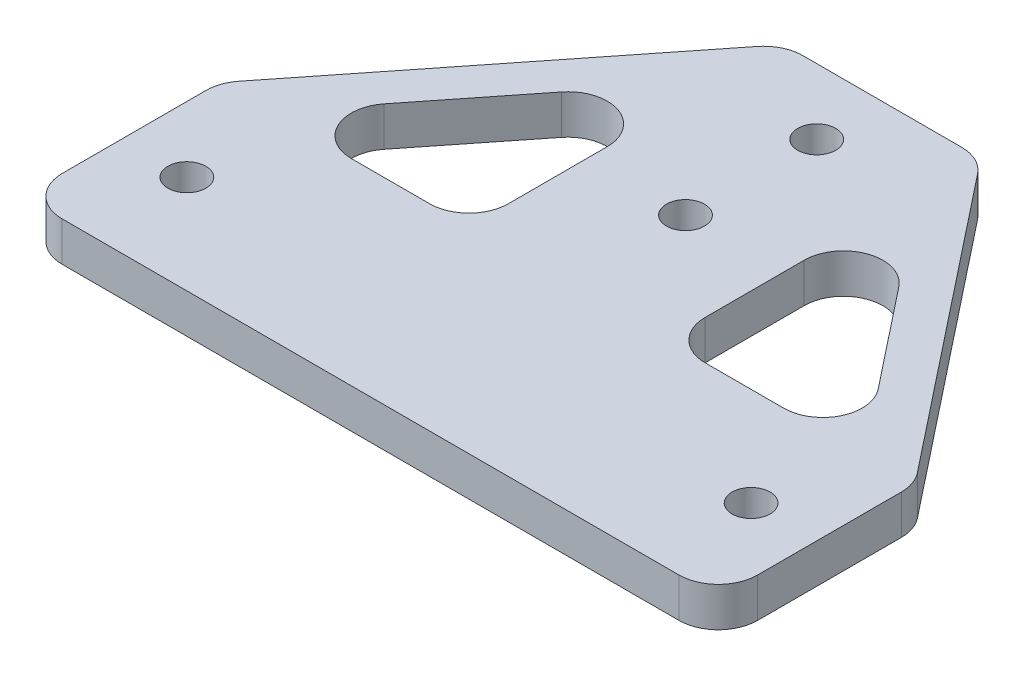
ISO-10303-21;
HEADER;
FILE_DESCRIPTION(('STEP AP214'),'2;1');
FILE_NAME('part.step','',(''),(''),'','','');
FILE_SCHEMA(('AUTOMOTIVE_DESIGN { 1 0 10303 214 1 1 1 1 }'));
ENDSEC;
DATA;
#1=APPLICATION_CONTEXT('core data for automotive mechanical design processes');
#2=APPLICATION_PROTOCOL_DEFINITION('international standard','automotive_design',2000,#1);
#3=PRODUCT_CONTEXT('',#1,'mechanical');
#4=PRODUCT('Part','Part','',(#3));
#5=PRODUCT_RELATED_PRODUCT_CATEGORY('part','',(#4));
#6=PRODUCT_DEFINITION_FORMATION('','',#4);
#7=PRODUCT_DEFINITION_CONTEXT('part definition',#1,'design');
#8=PRODUCT_DEFINITION('design','',#6,#7);
#9=PRODUCT_DEFINITION_SHAPE('','',#8);
#10=(LENGTH_UNIT() NAMED_UNIT(*) SI_UNIT(.MILLI.,.METRE.));
#11=(NAMED_UNIT(*) PLANE_ANGLE_UNIT() SI_UNIT($,.RADIAN.));
#12=(NAMED_UNIT(*) SI_UNIT($,.STERADIAN.) SOLID_ANGLE_UNIT());
#13=UNCERTAINTY_MEASURE_WITH_UNIT(LENGTH_MEASURE(1.E-05),#10,'distance_accuracy_value','');
#14=(GEOMETRIC_REPRESENTATION_CONTEXT(3) GLOBAL_UNCERTAINTY_ASSIGNED_CONTEXT((#13)) GLOBAL_UNIT_ASSIGNED_CONTEXT((#10,
#11,#12)) REPRESENTATION_CONTEXT('',''));
#15=CARTESIAN_POINT('',(0.,0.,0.));
#16=DIRECTION('',(0.,0.,1.));
#17=DIRECTION('',(1.,0.,0.));
#18=AXIS2_PLACEMENT_3D('',#15,#16,#17);
#19=CARTESIAN_POINT('',(0.,3.,-7.5));
#20=DIRECTION('',(0.,0.,1.));
#21=DIRECTION('',(1.,0.,0.));
#22=AXIS2_PLACEMENT_3D('',#19,#20,#21);
#23=PLANE('',#22);
#24=DIRECTION('',(-1.,0.,0.));
#25=VECTOR('',#24,1.);
#26=CARTESIAN_POINT('',(0.,3.,-7.5));
#27=LINE('',#26,#25);
#28=CARTESIAN_POINT('',(16.472386067493,3.,-7.5));
#29=VERTEX_POINT('',#28);
#30=CARTESIAN_POINT('',(10.5,3.,-7.5));
#31=VERTEX_POINT('',#30);
#32=EDGE_CURVE('E226',#29,#31,#27,.T.);
#33=ORIENTED_EDGE('',*,*,#32,.F.);
#34=DIRECTION('',(0.,-1.,0.));
#35=VECTOR('',#34,1.);
#36=CARTESIAN_POINT('',(16.472386067493,0.,-7.5));
#37=LINE('',#36,#35);
#38=CARTESIAN_POINT('',(16.472386067493,0.,-7.5));
#39=VERTEX_POINT('',#38);
#40=EDGE_CURVE('E211',#29,#39,#37,.T.);
#41=ORIENTED_EDGE('',*,*,#40,.T.);
#42=DIRECTION('',(-1.,0.,0.));
#43=VECTOR('',#42,1.);
#44=CARTESIAN_POINT('',(0.,0.,-7.5));
#45=LINE('',#44,#43);
#46=CARTESIAN_POINT('',(10.5,0.,-7.5));
#47=VERTEX_POINT('',#46);
#48=EDGE_CURVE('E223',#39,#47,#45,.T.);
#49=ORIENTED_EDGE('',*,*,#48,.T.);
#50=DIRECTION('',(0.,-1.,0.));
#51=VECTOR('',#50,1.);
#52=CARTESIAN_POINT('',(10.5,3.,-7.5));
#53=LINE('',#52,#51);
#54=EDGE_CURVE('E228',#47,#31,#53,.F.);
#55=ORIENTED_EDGE('',*,*,#54,.T.);
#56=EDGE_LOOP('',(#33,#41,#49,#55));
#57=FACE_BOUND('',#56,.T.);
#58=ADVANCED_FACE('F45',(#57),#23,.F.);
#59=CARTESIAN_POINT('',(7.50000000000001,3.,0.));
#60=DIRECTION('',(-1.,0.,0.));
#61=DIRECTION('',(0.,0.,1.));
#62=AXIS2_PLACEMENT_3D('',#59,#60,#61);
#63=PLANE('',#62);
#64=DIRECTION('',(0.,0.,-1.));
#65=VECTOR('',#64,1.);
#66=CARTESIAN_POINT('',(7.50000000000001,0.,0.));
#67=LINE('',#66,#65);
#68=CARTESIAN_POINT('',(7.5,0.,-10.5));
#69=VERTEX_POINT('',#68);
#70=CARTESIAN_POINT('',(7.5,0.,-18.0440666115701));
#71=VERTEX_POINT('',#70);
#72=EDGE_CURVE('E232',#69,#71,#67,.T.);
#73=ORIENTED_EDGE('',*,*,#72,.T.);
#74=DIRECTION('',(0.,-1.,0.));
#75=VECTOR('',#74,1.);
#76=CARTESIAN_POINT('',(7.5,3.,-18.0440666115701));
#77=LINE('',#76,#75);
#78=CARTESIAN_POINT('',(7.5,3.,-18.0440666115701));
#79=VERTEX_POINT('',#78);
#80=EDGE_CURVE('E253',#71,#79,#77,.F.);
#81=ORIENTED_EDGE('',*,*,#80,.T.);
#82=DIRECTION('',(0.,0.,-1.));
#83=VECTOR('',#82,1.);
#84=CARTESIAN_POINT('',(7.50000000000001,3.,0.));
#85=LINE('',#84,#83);
#86=CARTESIAN_POINT('',(7.5,3.,-10.5));
#87=VERTEX_POINT('',#86);
#88=EDGE_CURVE('E412',#87,#79,#85,.T.);
#89=ORIENTED_EDGE('',*,*,#88,.F.);
#90=DIRECTION('',(0.,-1.,0.));
#91=VECTOR('',#90,1.);
#92=CARTESIAN_POINT('',(7.5,0.,-10.5));
#93=LINE('',#92,#91);
#94=EDGE_CURVE('E250',#87,#69,#93,.T.);
#95=ORIENTED_EDGE('',*,*,#94,.T.);
#96=EDGE_LOOP('',(#73,#81,#89,#95));
#97=FACE_BOUND('',#96,.T.);
#98=ADVANCED_FACE('F450',(#97),#63,.F.);
#99=CARTESIAN_POINT('',(19.940234791889,3.,-15.7860192102455));
#100=DIRECTION('',(0.784045824461761,0.,-0.620702944365561));
#101=DIRECTION('',(-0.620702944365561,0.,-0.784045824461762));
#102=AXIS2_PLACEMENT_3D('',#99,#100,#101);
#103=PLANE('',#102);
#104=DIRECTION('',(0.620702944365561,0.,0.784045824461762));
#105=VECTOR('',#104,1.);
#106=CARTESIAN_POINT('',(19.940234791889,0.,-15.7860192102455));
#107=LINE('',#106,#105);
#108=CARTESIAN_POINT('',(8.4008305071318,0.,-30.3621088330967));
#109=VERTEX_POINT('',#108);
#110=CARTESIAN_POINT('',(25.8521374733853,0.,-8.31835266519754));
#111=VERTEX_POINT('',#110);
#112=EDGE_CURVE('E378',#109,#111,#107,.T.);
#113=ORIENTED_EDGE('',*,*,#112,.F.);
#114=DIRECTION('',(0.,-1.,0.));
#115=VECTOR('',#114,1.);
#116=CARTESIAN_POINT('',(8.4008305071318,3.,-30.3621088330967));
#117=LINE('',#116,#115);
#118=CARTESIAN_POINT('',(8.4008305071318,3.,-30.3621088330967));
#119=VERTEX_POINT('',#118);
#120=EDGE_CURVE('E305',#109,#119,#117,.F.);
#121=ORIENTED_EDGE('',*,*,#120,.T.);
#122=DIRECTION('',(0.620702944365561,0.,0.784045824461762));
#123=VECTOR('',#122,1.);
#124=CARTESIAN_POINT('',(19.940234791889,3.,-15.7860192102455));
#125=LINE('',#124,#123);
#126=CARTESIAN_POINT('',(25.8521374733853,3.,-8.31835266519754));
#127=VERTEX_POINT('',#126);
#128=EDGE_CURVE('E734',#119,#127,#125,.T.);
#129=ORIENTED_EDGE('',*,*,#128,.T.);
#130=DIRECTION('',(0.,-1.,0.));
#131=VECTOR('',#130,1.);
#132=CARTESIAN_POINT('',(25.8521374733853,0.,-8.31835266519754));
#133=LINE('',#132,#131);
#134=EDGE_CURVE('E302',#127,#111,#133,.T.);
#135=ORIENTED_EDGE('',*,*,#134,.T.);
#136=EDGE_LOOP('',(#113,#121,#129,#135));
#137=FACE_BOUND('',#136,.T.);
#138=ADVANCED_FACE('F456',(#137),#103,.T.);
#139=CARTESIAN_POINT('',(0.,3.,-31.5));
#140=DIRECTION('',(0.,0.,-1.));
#141=DIRECTION('',(-1.,0.,0.));
#142=AXIS2_PLACEMENT_3D('',#139,#140,#141);
#143=PLANE('',#142);
#144=DIRECTION('',(1.,0.,0.));
#145=VECTOR('',#144,1.);
#146=CARTESIAN_POINT('',(0.,0.,-31.5));
#147=LINE('',#146,#145);
#148=CARTESIAN_POINT('',(-6.04869303374651,0.,-31.5));
#149=VERTEX_POINT('',#148);
#150=CARTESIAN_POINT('',(6.04869303374652,0.,-31.5));
#151=VERTEX_POINT('',#150);
#152=EDGE_CURVE('E381',#149,#151,#147,.T.);
#153=ORIENTED_EDGE('',*,*,#152,.F.);
#154=DIRECTION('',(0.,-1.,0.));
#155=VECTOR('',#154,1.);
#156=CARTESIAN_POINT('',(-6.04869303374651,3.,-31.5));
#157=LINE('',#156,#155);
#158=CARTESIAN_POINT('',(-6.04869303374651,3.,-31.5));
#159=VERTEX_POINT('',#158);
#160=EDGE_CURVE('E300',#149,#159,#157,.F.);
#161=ORIENTED_EDGE('',*,*,#160,.T.);
#162=DIRECTION('',(1.,0.,0.));
#163=VECTOR('',#162,1.);
#164=CARTESIAN_POINT('',(0.,3.,-31.5));
#165=LINE('',#164,#163);
#166=CARTESIAN_POINT('',(6.04869303374652,3.,-31.5));
#167=VERTEX_POINT('',#166);
#168=EDGE_CURVE('E737',#159,#167,#165,.T.);
#169=ORIENTED_EDGE('',*,*,#168,.T.);
#170=DIRECTION('',(0.,-1.,0.));
#171=VECTOR('',#170,1.);
#172=CARTESIAN_POINT('',(6.04869303374652,3.,-31.5));
#173=LINE('',#172,#171);
#174=EDGE_CURVE('E297',#167,#151,#173,.T.);
#175=ORIENTED_EDGE('',*,*,#174,.T.);
#176=EDGE_LOOP('',(#153,#161,#169,#175));
#177=FACE_BOUND('',#176,.T.);
#178=ADVANCED_FACE('F471',(#177),#143,.T.);
#179=CARTESIAN_POINT('',(-19.940234791889,3.,-15.7860192102455));
#180=DIRECTION('',(-0.784045824461761,0.,-0.620702944365561));
#181=DIRECTION('',(-0.620702944365561,0.,0.784045824461762));
#182=AXIS2_PLACEMENT_3D('',#179,#180,#181);
#183=PLANE('',#182);
#184=DIRECTION('',(0.620702944365561,0.,-0.784045824461762));
#185=VECTOR('',#184,1.);
#186=CARTESIAN_POINT('',(-19.940234791889,0.,-15.7860192102455));
#187=LINE('',#186,#185);
#188=CARTESIAN_POINT('',(-25.8521374733853,0.,-8.31835266519753));
#189=VERTEX_POINT('',#188);
#190=CARTESIAN_POINT('',(-8.40083050713179,0.,-30.3621088330967));
#191=VERTEX_POINT('',#190);
#192=EDGE_CURVE('E384',#189,#191,#187,.T.);
#193=ORIENTED_EDGE('',*,*,#192,.F.);
#194=DIRECTION('',(0.,-1.,0.));
#195=VECTOR('',#194,1.);
#196=CARTESIAN_POINT('',(-25.8521374733853,3.,-8.31835266519753));
#197=LINE('',#196,#195);
#198=CARTESIAN_POINT('',(-25.8521374733853,3.,-8.31835266519753));
#199=VERTEX_POINT('',#198);
#200=EDGE_CURVE('E295',#189,#199,#197,.F.);
#201=ORIENTED_EDGE('',*,*,#200,.T.);
#202=DIRECTION('',(0.620702944365561,0.,-0.784045824461762));
#203=VECTOR('',#202,1.);
#204=CARTESIAN_POINT('',(-19.940234791889,3.,-15.7860192102455));
#205=LINE('',#204,#203);
#206=CARTESIAN_POINT('',(-8.40083050713179,3.,-30.3621088330967));
#207=VERTEX_POINT('',#206);
#208=EDGE_CURVE('E740',#199,#207,#205,.T.);
#209=ORIENTED_EDGE('',*,*,#208,.T.);
#210=DIRECTION('',(0.,-1.,0.));
#211=VECTOR('',#210,1.);
#212=CARTESIAN_POINT('',(-8.40083050713179,3.,-30.3621088330967));
#213=LINE('',#212,#211);
#214=EDGE_CURVE('E292',#207,#191,#213,.T.);
#215=ORIENTED_EDGE('',*,*,#214,.T.);
#216=EDGE_LOOP('',(#193,#201,#209,#215));
#217=FACE_BOUND('',#216,.T.);
#218=ADVANCED_FACE('F468',(#217),#183,.T.);
#219=CARTESIAN_POINT('',(-26.5,3.,0.));
#220=DIRECTION('',(-1.,0.,0.));
#221=DIRECTION('',(0.,0.,1.));
#222=AXIS2_PLACEMENT_3D('',#219,#220,#221);
#223=PLANE('',#222);
#224=DIRECTION('',(0.,0.,-1.));
#225=VECTOR('',#224,1.);
#226=CARTESIAN_POINT('',(-26.5,0.,0.));
#227=LINE('',#226,#225);
#228=CARTESIAN_POINT('',(-26.5,0.,4.5));
#229=VERTEX_POINT('',#228);
#230=CARTESIAN_POINT('',(-26.5,0.,-6.45624383210085));
#231=VERTEX_POINT('',#230);
#232=EDGE_CURVE('E387',#229,#231,#227,.T.);
#233=ORIENTED_EDGE('',*,*,#232,.F.);
#234=DIRECTION('',(0.,-1.,0.));
#235=VECTOR('',#234,1.);
#236=CARTESIAN_POINT('',(-26.5,3.,4.5));
#237=LINE('',#236,#235);
#238=CARTESIAN_POINT('',(-26.5,3.,4.5));
#239=VERTEX_POINT('',#238);
#240=EDGE_CURVE('E67',#229,#239,#237,.F.);
#241=ORIENTED_EDGE('',*,*,#240,.T.);
#242=DIRECTION('',(0.,0.,-1.));
#243=VECTOR('',#242,1.);
#244=CARTESIAN_POINT('',(-26.5,3.,0.));
#245=LINE('',#244,#243);
#246=CARTESIAN_POINT('',(-26.5,3.,-6.45624383210085));
#247=VERTEX_POINT('',#246);
#248=EDGE_CURVE('E414',#239,#247,#245,.T.);
#249=ORIENTED_EDGE('',*,*,#248,.T.);
#250=DIRECTION('',(0.,-1.,0.));
#251=VECTOR('',#250,1.);
#252=CARTESIAN_POINT('',(-26.5,3.,-6.45624383210085));
#253=LINE('',#252,#251);
#254=EDGE_CURVE('E288',#247,#231,#253,.T.);
#255=ORIENTED_EDGE('',*,*,#254,.T.);
#256=EDGE_LOOP('',(#233,#241,#249,#255));
#257=FACE_BOUND('',#256,.T.);
#258=ADVANCED_FACE('F465',(#257),#223,.T.);
#259=CARTESIAN_POINT('',(0.,3.,7.5));
#260=DIRECTION('',(0.,0.,-1.));
#261=DIRECTION('',(-1.,0.,0.));
#262=AXIS2_PLACEMENT_3D('',#259,#260,#261);
#263=PLANE('',#262);
#264=DIRECTION('',(1.,0.,0.));
#265=VECTOR('',#264,1.);
#266=CARTESIAN_POINT('',(0.,0.,7.5));
#267=LINE('',#266,#265);
#268=CARTESIAN_POINT('',(-23.5,0.,7.5));
#269=VERTEX_POINT('',#268);
#270=CARTESIAN_POINT('',(23.5,0.,7.5));
#271=VERTEX_POINT('',#270);
#272=EDGE_CURVE('E239',#269,#271,#267,.T.);
#273=ORIENTED_EDGE('',*,*,#272,.T.);
#274=DIRECTION('',(0.,-1.,0.));
#275=VECTOR('',#274,1.);
#276=CARTESIAN_POINT('',(23.5,3.,7.5));
#277=LINE('',#276,#275);
#278=CARTESIAN_POINT('',(23.5,3.,7.5));
#279=VERTEX_POINT('',#278);
#280=EDGE_CURVE('E275',#271,#279,#277,.F.);
#281=ORIENTED_EDGE('',*,*,#280,.T.);
#282=DIRECTION('',(1.,0.,0.));
#283=VECTOR('',#282,1.);
#284=CARTESIAN_POINT('',(0.,3.,7.5));
#285=LINE('',#284,#283);
#286=CARTESIAN_POINT('',(-23.5,3.,7.5));
#287=VERTEX_POINT('',#286);
#288=EDGE_CURVE('E406',#287,#279,#285,.T.);
#289=ORIENTED_EDGE('',*,*,#288,.F.);
#290=DIRECTION('',(0.,-1.,0.));
#291=VECTOR('',#290,1.);
#292=CARTESIAN_POINT('',(-23.5,0.,7.5));
#293=LINE('',#292,#291);
#294=EDGE_CURVE('E272',#287,#269,#293,.T.);
#295=ORIENTED_EDGE('',*,*,#294,.T.);
#296=EDGE_LOOP('',(#273,#281,#289,#295));
#297=FACE_BOUND('',#296,.T.);
#298=ADVANCED_FACE('F393',(#297),#263,.F.);
#299=CARTESIAN_POINT('',(-7.5,3.,0.));
#300=DIRECTION('',(-1.,0.,0.));
#301=DIRECTION('',(0.,0.,1.));
#302=AXIS2_PLACEMENT_3D('',#299,#300,#301);
#303=PLANE('',#302);
#304=DIRECTION('',(0.,0.,-1.));
#305=VECTOR('',#304,1.);
#306=CARTESIAN_POINT('',(-7.5,3.,0.));
#307=LINE('',#306,#305);
#308=CARTESIAN_POINT('',(-7.5,3.,-10.5));
#309=VERTEX_POINT('',#308);
#310=CARTESIAN_POINT('',(-7.5,3.,-18.0440666115701));
#311=VERTEX_POINT('',#310);
#312=EDGE_CURVE('E346',#309,#311,#307,.T.);
#313=ORIENTED_EDGE('',*,*,#312,.T.);
#314=DIRECTION('',(0.,-1.,0.));
#315=VECTOR('',#314,1.);
#316=CARTESIAN_POINT('',(-7.5,0.,-18.0440666115701));
#317=LINE('',#316,#315);
#318=CARTESIAN_POINT('',(-7.5,0.,-18.0440666115701));
#319=VERTEX_POINT('',#318);
#320=EDGE_CURVE('E309',#311,#319,#317,.T.);
#321=ORIENTED_EDGE('',*,*,#320,.T.);
#322=DIRECTION('',(0.,0.,-1.));
#323=VECTOR('',#322,1.);
#324=CARTESIAN_POINT('',(-7.5,0.,0.));
#325=LINE('',#324,#323);
#326=CARTESIAN_POINT('',(-7.5,0.,-10.5));
#327=VERTEX_POINT('',#326);
#328=EDGE_CURVE('E362',#327,#319,#325,.T.);
#329=ORIENTED_EDGE('',*,*,#328,.F.);
#330=DIRECTION('',(0.,-1.,0.));
#331=VECTOR('',#330,1.);
#332=CARTESIAN_POINT('',(-7.5,3.,-10.5));
#333=LINE('',#332,#331);
#334=EDGE_CURVE('E307',#327,#309,#333,.F.);
#335=ORIENTED_EDGE('',*,*,#334,.T.);
#336=EDGE_LOOP('',(#313,#321,#329,#335));
#337=FACE_BOUND('',#336,.T.);
#338=ADVANCED_FACE('F365',(#337),#303,.T.);
#339=CARTESIAN_POINT('',(0.,3.,-7.5));
#340=DIRECTION('',(0.,0.,-1.));
#341=DIRECTION('',(-1.,0.,0.));
#342=AXIS2_PLACEMENT_3D('',#339,#340,#341);
#343=PLANE('',#342);
#344=DIRECTION('',(1.,0.,0.));
#345=VECTOR('',#344,1.);
#346=CARTESIAN_POINT('',(0.,0.,-7.5));
#347=LINE('',#346,#345);
#348=CARTESIAN_POINT('',(-16.472386067493,0.,-7.5));
#349=VERTEX_POINT('',#348);
#350=CARTESIAN_POINT('',(-10.5,0.,-7.5));
#351=VERTEX_POINT('',#350);
#352=EDGE_CURVE('E363',#349,#351,#347,.T.);
#353=ORIENTED_EDGE('',*,*,#352,.F.);
#354=DIRECTION('',(0.,-1.,0.));
#355=VECTOR('',#354,1.);
#356=CARTESIAN_POINT('',(-16.472386067493,3.,-7.5));
#357=LINE('',#356,#355);
#358=CARTESIAN_POINT('',(-16.472386067493,3.,-7.5));
#359=VERTEX_POINT('',#358);
#360=EDGE_CURVE('E218',#349,#359,#357,.F.);
#361=ORIENTED_EDGE('',*,*,#360,.T.);
#362=DIRECTION('',(1.,0.,0.));
#363=VECTOR('',#362,1.);
#364=CARTESIAN_POINT('',(0.,3.,-7.5));
#365=LINE('',#364,#363);
#366=CARTESIAN_POINT('',(-10.5,3.,-7.5));
#367=VERTEX_POINT('',#366);
#368=EDGE_CURVE('E343',#359,#367,#365,.T.);
#369=ORIENTED_EDGE('',*,*,#368,.T.);
#370=DIRECTION('',(0.,-1.,0.));
#371=VECTOR('',#370,1.);
#372=CARTESIAN_POINT('',(-10.5,0.,-7.5));
#373=LINE('',#372,#371);
#374=EDGE_CURVE('E317',#367,#351,#373,.T.);
#375=ORIENTED_EDGE('',*,*,#374,.T.);
#376=EDGE_LOOP('',(#353,#361,#369,#375));
#377=FACE_BOUND('',#376,.T.);
#378=ADVANCED_FACE('F352',(#377),#343,.T.);
#379=CARTESIAN_POINT('',(26.5,3.,0.));
#380=DIRECTION('',(-1.,0.,0.));
#381=DIRECTION('',(0.,0.,1.));
#382=AXIS2_PLACEMENT_3D('',#379,#380,#381);
#383=PLANE('',#382);
#384=DIRECTION('',(0.,0.,-1.));
#385=VECTOR('',#384,1.);
#386=CARTESIAN_POINT('',(26.5,3.,0.));
#387=LINE('',#386,#385);
#388=CARTESIAN_POINT('',(26.5,3.,4.5));
#389=VERTEX_POINT('',#388);
#390=CARTESIAN_POINT('',(26.5,3.,-6.45624383210086));
#391=VERTEX_POINT('',#390);
#392=EDGE_CURVE('E404',#389,#391,#387,.T.);
#393=ORIENTED_EDGE('',*,*,#392,.F.);
#394=DIRECTION('',(0.,-1.,0.));
#395=VECTOR('',#394,1.);
#396=CARTESIAN_POINT('',(26.5,3.,4.5));
#397=LINE('',#396,#395);
#398=CARTESIAN_POINT('',(26.5,0.,4.5));
#399=VERTEX_POINT('',#398);
#400=EDGE_CURVE('E257',#389,#399,#397,.T.);
#401=ORIENTED_EDGE('',*,*,#400,.T.);
#402=DIRECTION('',(0.,0.,-1.));
#403=VECTOR('',#402,1.);
#404=CARTESIAN_POINT('',(26.5,0.,0.));
#405=LINE('',#404,#403);
#406=CARTESIAN_POINT('',(26.5,0.,-6.45624383210086));
#407=VERTEX_POINT('',#406);
#408=EDGE_CURVE('E233',#399,#407,#405,.T.);
#409=ORIENTED_EDGE('',*,*,#408,.T.);
#410=DIRECTION('',(0.,-1.,0.));
#411=VECTOR('',#410,1.);
#412=CARTESIAN_POINT('',(26.5,3.,-6.45624383210086));
#413=LINE('',#412,#411);
#414=EDGE_CURVE('E255',#407,#391,#413,.F.);
#415=ORIENTED_EDGE('',*,*,#414,.T.);
#416=EDGE_LOOP('',(#393,#401,#409,#415));
#417=FACE_BOUND('',#416,.T.);
#418=ADVANCED_FACE('F408',(#417),#383,.F.);
#419=CARTESIAN_POINT('',(-17.5880973185037,3.,-13.9239103771488));
#420=DIRECTION('',(0.784045824461762,0.,0.620702944365561));
#421=DIRECTION('',(0.620702944365561,0.,-0.784045824461762));
#422=AXIS2_PLACEMENT_3D('',#419,#420,#421);
#423=PLANE('',#422);
#424=DIRECTION('',(-0.620702944365561,0.,0.784045824461762));
#425=VECTOR('',#424,1.);
#426=CARTESIAN_POINT('',(-17.5880973185037,0.,-13.9239103771488));
#427=LINE('',#426,#425);
#428=CARTESIAN_POINT('',(-12.8521374733853,0.,-19.9061754446668));
#429=VERTEX_POINT('',#428);
#430=CARTESIAN_POINT('',(-18.8245235408783,0.,-12.3621088330967));
#431=VERTEX_POINT('',#430);
#432=EDGE_CURVE('E369',#429,#431,#427,.T.);
#433=ORIENTED_EDGE('',*,*,#432,.F.);
#434=DIRECTION('',(0.,-1.,0.));
#435=VECTOR('',#434,1.);
#436=CARTESIAN_POINT('',(-12.8521374733853,3.,-19.9061754446668));
#437=LINE('',#436,#435);
#438=CARTESIAN_POINT('',(-12.8521374733853,3.,-19.9061754446668));
#439=VERTEX_POINT('',#438);
#440=EDGE_CURVE('E315',#429,#439,#437,.F.);
#441=ORIENTED_EDGE('',*,*,#440,.T.);
#442=DIRECTION('',(-0.620702944365561,0.,0.784045824461762));
#443=VECTOR('',#442,1.);
#444=CARTESIAN_POINT('',(-17.5880973185037,3.,-13.9239103771488));
#445=LINE('',#444,#443);
#446=CARTESIAN_POINT('',(-18.8245235408783,3.,-12.3621088330967));
#447=VERTEX_POINT('',#446);
#448=EDGE_CURVE('E355',#439,#447,#445,.T.);
#449=ORIENTED_EDGE('',*,*,#448,.T.);
#450=DIRECTION('',(0.,-1.,0.));
#451=VECTOR('',#450,1.);
#452=CARTESIAN_POINT('',(-18.8245235408783,0.,-12.3621088330967));
#453=LINE('',#452,#451);
#454=EDGE_CURVE('E312',#447,#431,#453,.T.);
#455=ORIENTED_EDGE('',*,*,#454,.T.);
#456=EDGE_LOOP('',(#433,#441,#449,#455));
#457=FACE_BOUND('',#456,.T.);
#458=ADVANCED_FACE('F445',(#457),#423,.T.);
#459=CARTESIAN_POINT('',(-21.5,3.,0.));
#460=DIRECTION('',(0.,-1.,0.));
#461=DIRECTION('',(0.,0.,-1.));
#462=AXIS2_PLACEMENT_3D('',#459,#460,#461);
#463=CYLINDRICAL_SURFACE('',#462,1.45);
#464=CARTESIAN_POINT('',(-21.5,3.,0.));
#465=DIRECTION('',(0.,1.,0.));
#466=DIRECTION('',(0.,0.,1.));
#467=AXIS2_PLACEMENT_3D('',#464,#465,#466);
#468=CIRCLE('',#467,1.45);
#469=CARTESIAN_POINT('',(-21.5,3.,1.45));
#470=VERTEX_POINT('',#469);
#471=EDGE_CURVE('E728',#470,#470,#468,.T.);
#472=ORIENTED_EDGE('',*,*,#471,.T.);
#473=EDGE_LOOP('',(#472));
#474=FACE_BOUND('',#473,.T.);
#475=CARTESIAN_POINT('',(-21.5,0.,0.));
#476=DIRECTION('',(0.,1.,0.));
#477=DIRECTION('',(0.,0.,1.));
#478=AXIS2_PLACEMENT_3D('',#475,#476,#477);
#479=CIRCLE('',#478,1.45);
#480=CARTESIAN_POINT('',(-21.5,0.,1.45));
#481=VERTEX_POINT('',#480);
#482=EDGE_CURVE('E367',#481,#481,#479,.T.);
#483=ORIENTED_EDGE('',*,*,#482,.F.);
#484=EDGE_LOOP('',(#483));
#485=FACE_BOUND('',#484,.T.);
#486=ADVANCED_FACE('F435',(#474,#485),#463,.F.);
#487=CARTESIAN_POINT('',(21.5,3.,0.));
#488=DIRECTION('',(0.,-1.,0.));
#489=DIRECTION('',(0.,0.,-1.));
#490=AXIS2_PLACEMENT_3D('',#487,#488,#489);
#491=CYLINDRICAL_SURFACE('',#490,1.45);
#492=CARTESIAN_POINT('',(21.5,3.,0.));
#493=DIRECTION('',(0.,1.,0.));
#494=DIRECTION('',(0.,0.,1.));
#495=AXIS2_PLACEMENT_3D('',#492,#493,#494);
#496=CIRCLE('',#495,1.45);
#497=CARTESIAN_POINT('',(21.5,3.,1.45));
#498=VERTEX_POINT('',#497);
#499=EDGE_CURVE('E724',#498,#498,#496,.T.);
#500=ORIENTED_EDGE('',*,*,#499,.T.);
#501=EDGE_LOOP('',(#500));
#502=FACE_BOUND('',#501,.T.);
#503=CARTESIAN_POINT('',(21.5,0.,0.));
#504=DIRECTION('',(0.,1.,0.));
#505=DIRECTION('',(0.,0.,1.));
#506=AXIS2_PLACEMENT_3D('',#503,#504,#505);
#507=CIRCLE('',#506,1.45);
#508=CARTESIAN_POINT('',(21.5,0.,1.45));
#509=VERTEX_POINT('',#508);
#510=EDGE_CURVE('E372',#509,#509,#507,.T.);
#511=ORIENTED_EDGE('',*,*,#510,.F.);
#512=EDGE_LOOP('',(#511));
#513=FACE_BOUND('',#512,.T.);
#514=ADVANCED_FACE('F432',(#502,#513),#491,.F.);
#515=CARTESIAN_POINT('',(0.,3.,-16.5));
#516=DIRECTION('',(0.,-1.,0.));
#517=DIRECTION('',(0.,0.,-1.));
#518=AXIS2_PLACEMENT_3D('',#515,#516,#517);
#519=CYLINDRICAL_SURFACE('',#518,1.45);
#520=CARTESIAN_POINT('',(0.,3.,-16.5));
#521=DIRECTION('',(0.,1.,0.));
#522=DIRECTION('',(0.,0.,1.));
#523=AXIS2_PLACEMENT_3D('',#520,#521,#522);
#524=CIRCLE('',#523,1.45);
#525=CARTESIAN_POINT('',(0.,3.,-15.05));
#526=VERTEX_POINT('',#525);
#527=EDGE_CURVE('E721',#526,#526,#524,.T.);
#528=ORIENTED_EDGE('',*,*,#527,.T.);
#529=EDGE_LOOP('',(#528));
#530=FACE_BOUND('',#529,.T.);
#531=CARTESIAN_POINT('',(0.,0.,-16.5));
#532=DIRECTION('',(0.,1.,0.));
#533=DIRECTION('',(0.,0.,1.));
#534=AXIS2_PLACEMENT_3D('',#531,#532,#533);
#535=CIRCLE('',#534,1.45);
#536=CARTESIAN_POINT('',(0.,0.,-15.05));
#537=VERTEX_POINT('',#536);
#538=EDGE_CURVE('E425',#537,#537,#535,.T.);
#539=ORIENTED_EDGE('',*,*,#538,.F.);
#540=EDGE_LOOP('',(#539));
#541=FACE_BOUND('',#540,.T.);
#542=ADVANCED_FACE('F434',(#530,#541),#519,.F.);
#543=CARTESIAN_POINT('',(0.,3.,-26.5));
#544=DIRECTION('',(0.,-1.,0.));
#545=DIRECTION('',(0.,0.,-1.));
#546=AXIS2_PLACEMENT_3D('',#543,#544,#545);
#547=CYLINDRICAL_SURFACE('',#546,1.45);
#548=CARTESIAN_POINT('',(0.,3.,-26.5));
#549=DIRECTION('',(0.,1.,0.));
#550=DIRECTION('',(0.,0.,1.));
#551=AXIS2_PLACEMENT_3D('',#548,#549,#550);
#552=CIRCLE('',#551,1.45);
#553=CARTESIAN_POINT('',(0.,3.,-25.05));
#554=VERTEX_POINT('',#553);
#555=EDGE_CURVE('E244',#554,#554,#552,.T.);
#556=ORIENTED_EDGE('',*,*,#555,.T.);
#557=EDGE_LOOP('',(#556));
#558=FACE_BOUND('',#557,.T.);
#559=CARTESIAN_POINT('',(0.,0.,-26.5));
#560=DIRECTION('',(0.,1.,0.));
#561=DIRECTION('',(0.,0.,1.));
#562=AXIS2_PLACEMENT_3D('',#559,#560,#561);
#563=CIRCLE('',#562,1.45);
#564=CARTESIAN_POINT('',(0.,0.,-25.05));
#565=VERTEX_POINT('',#564);
#566=EDGE_CURVE('E422',#565,#565,#563,.T.);
#567=ORIENTED_EDGE('',*,*,#566,.F.);
#568=EDGE_LOOP('',(#567));
#569=FACE_BOUND('',#568,.T.);
#570=ADVANCED_FACE('F442',(#558,#569),#547,.F.);
#571=CARTESIAN_POINT('',(17.5880973185037,3.,-13.9239103771488));
#572=DIRECTION('',(0.784045824461761,0.,-0.620702944365561));
#573=DIRECTION('',(-0.620702944365561,0.,-0.784045824461762));
#574=AXIS2_PLACEMENT_3D('',#571,#572,#573);
#575=PLANE('',#574);
#576=DIRECTION('',(0.620702944365561,0.,0.784045824461762));
#577=VECTOR('',#576,1.);
#578=CARTESIAN_POINT('',(17.5880973185037,0.,-13.9239103771488));
#579=LINE('',#578,#577);
#580=CARTESIAN_POINT('',(12.8521374733853,0.,-19.9061754446668));
#581=VERTEX_POINT('',#580);
#582=CARTESIAN_POINT('',(18.8245235408783,0.,-12.3621088330967));
#583=VERTEX_POINT('',#582);
#584=EDGE_CURVE('E236',#581,#583,#579,.T.);
#585=ORIENTED_EDGE('',*,*,#584,.T.);
#586=DIRECTION('',(0.,-1.,0.));
#587=VECTOR('',#586,1.);
#588=CARTESIAN_POINT('',(18.8245235408783,3.,-12.3621088330967));
#589=LINE('',#588,#587);
#590=CARTESIAN_POINT('',(18.8245235408783,3.,-12.3621088330967));
#591=VERTEX_POINT('',#590);
#592=EDGE_CURVE('E212',#583,#591,#589,.F.);
#593=ORIENTED_EDGE('',*,*,#592,.T.);
#594=DIRECTION('',(0.620702944365561,0.,0.784045824461762));
#595=VECTOR('',#594,1.);
#596=CARTESIAN_POINT('',(17.5880973185037,3.,-13.9239103771488));
#597=LINE('',#596,#595);
#598=CARTESIAN_POINT('',(12.8521374733853,3.,-19.9061754446668));
#599=VERTEX_POINT('',#598);
#600=EDGE_CURVE('E245',#599,#591,#597,.T.);
#601=ORIENTED_EDGE('',*,*,#600,.F.);
#602=DIRECTION('',(0.,-1.,0.));
#603=VECTOR('',#602,1.);
#604=CARTESIAN_POINT('',(12.8521374733853,0.,-19.9061754446668));
#605=LINE('',#604,#603);
#606=EDGE_CURVE('E227',#599,#581,#605,.T.);
#607=ORIENTED_EDGE('',*,*,#606,.T.);
#608=EDGE_LOOP('',(#585,#593,#601,#607));
#609=FACE_BOUND('',#608,.T.);
#610=ADVANCED_FACE('F509',(#609),#575,.F.);
#611=CARTESIAN_POINT('',(0.,3.,0.));
#612=DIRECTION('',(0.,1.,0.));
#613=DIRECTION('',(0.,0.,1.));
#614=AXIS2_PLACEMENT_3D('',#611,#612,#613);
#615=PLANE('',#614);
#616=ORIENTED_EDGE('',*,*,#555,.F.);
#617=EDGE_LOOP('',(#616));
#618=FACE_BOUND('',#617,.T.);
#619=ORIENTED_EDGE('',*,*,#527,.F.);
#620=EDGE_LOOP('',(#619));
#621=FACE_BOUND('',#620,.T.);
#622=ORIENTED_EDGE('',*,*,#499,.F.);
#623=EDGE_LOOP('',(#622));
#624=FACE_BOUND('',#623,.T.);
#625=ORIENTED_EDGE('',*,*,#471,.F.);
#626=EDGE_LOOP('',(#625));
#627=FACE_BOUND('',#626,.T.);
#628=ORIENTED_EDGE('',*,*,#312,.F.);
#629=CARTESIAN_POINT('',(-10.5,3.,-10.5));
#630=DIRECTION('',(0.,1.,0.));
#631=DIRECTION('',(0.,0.,1.));
#632=AXIS2_PLACEMENT_3D('',#629,#630,#631);
#633=CIRCLE('',#632,3.);
#634=EDGE_CURVE('E336',#309,#367,#633,.F.);
#635=ORIENTED_EDGE('',*,*,#634,.T.);
#636=ORIENTED_EDGE('',*,*,#368,.F.);
#637=CARTESIAN_POINT('',(-16.472386067493,3.,-10.5));
#638=DIRECTION('',(0.,1.,0.));
#639=DIRECTION('',(0.,0.,1.));
#640=AXIS2_PLACEMENT_3D('',#637,#638,#639);
#641=CIRCLE('',#640,3.);
#642=EDGE_CURVE('E332',#359,#447,#641,.F.);
#643=ORIENTED_EDGE('',*,*,#642,.T.);
#644=ORIENTED_EDGE('',*,*,#448,.F.);
#645=CARTESIAN_POINT('',(-10.5,3.,-18.0440666115701));
#646=DIRECTION('',(0.,1.,0.));
#647=DIRECTION('',(0.,0.,1.));
#648=AXIS2_PLACEMENT_3D('',#645,#646,#647);
#649=CIRCLE('',#648,3.);
#650=EDGE_CURVE('E328',#439,#311,#649,.F.);
#651=ORIENTED_EDGE('',*,*,#650,.T.);
#652=EDGE_LOOP('',(#628,#635,#636,#643,#644,#651));
#653=FACE_BOUND('',#652,.T.);
#654=ORIENTED_EDGE('',*,*,#288,.T.);
#655=CARTESIAN_POINT('',(23.5,3.,4.5));
#656=DIRECTION('',(0.,1.,0.));
#657=DIRECTION('',(0.,0.,1.));
#658=AXIS2_PLACEMENT_3D('',#655,#656,#657);
#659=CIRCLE('',#658,3.);
#660=EDGE_CURVE('E286',#279,#389,#659,.T.);
#661=ORIENTED_EDGE('',*,*,#660,.T.);
#662=ORIENTED_EDGE('',*,*,#392,.T.);
#663=CARTESIAN_POINT('',(23.5,3.,-6.45624383210086));
#664=DIRECTION('',(0.,1.,0.));
#665=DIRECTION('',(0.,0.,1.));
#666=AXIS2_PLACEMENT_3D('',#663,#664,#665);
#667=CIRCLE('',#666,3.);
#668=EDGE_CURVE('E277',#391,#127,#667,.T.);
#669=ORIENTED_EDGE('',*,*,#668,.T.);
#670=ORIENTED_EDGE('',*,*,#128,.F.);
#671=CARTESIAN_POINT('',(6.04869303374652,3.,-28.5));
#672=DIRECTION('',(0.,1.,0.));
#673=DIRECTION('',(0.,0.,1.));
#674=AXIS2_PLACEMENT_3D('',#671,#672,#673);
#675=CIRCLE('',#674,3.);
#676=EDGE_CURVE('E279',#119,#167,#675,.T.);
#677=ORIENTED_EDGE('',*,*,#676,.T.);
#678=ORIENTED_EDGE('',*,*,#168,.F.);
#679=CARTESIAN_POINT('',(-6.04869303374651,3.,-28.5));
#680=DIRECTION('',(0.,1.,0.));
#681=DIRECTION('',(0.,0.,1.));
#682=AXIS2_PLACEMENT_3D('',#679,#680,#681);
#683=CIRCLE('',#682,3.);
#684=EDGE_CURVE('E281',#159,#207,#683,.T.);
#685=ORIENTED_EDGE('',*,*,#684,.T.);
#686=ORIENTED_EDGE('',*,*,#208,.F.);
#687=CARTESIAN_POINT('',(-23.5,3.,-6.45624383210085));
#688=DIRECTION('',(0.,1.,0.));
#689=DIRECTION('',(0.,0.,1.));
#690=AXIS2_PLACEMENT_3D('',#687,#688,#689);
#691=CIRCLE('',#690,3.);
#692=EDGE_CURVE('E60',#199,#247,#691,.T.);
#693=ORIENTED_EDGE('',*,*,#692,.T.);
#694=ORIENTED_EDGE('',*,*,#248,.F.);
#695=CARTESIAN_POINT('',(-23.5,3.,4.5));
#696=DIRECTION('',(0.,1.,0.));
#697=DIRECTION('',(0.,0.,1.));
#698=AXIS2_PLACEMENT_3D('',#695,#696,#697);
#699=CIRCLE('',#698,3.);
#700=EDGE_CURVE('E284',#239,#287,#699,.T.);
#701=ORIENTED_EDGE('',*,*,#700,.T.);
#702=EDGE_LOOP('',(#654,#661,#662,#669,#670,#677,#678,#685,#686,#693,#694,#701));
#703=FACE_BOUND('',#702,.T.);
#704=ORIENTED_EDGE('',*,*,#600,.T.);
#705=CARTESIAN_POINT('',(16.472386067493,3.,-10.5));
#706=DIRECTION('',(0.,1.,0.));
#707=DIRECTION('',(0.,0.,1.));
#708=AXIS2_PLACEMENT_3D('',#705,#706,#707);
#709=CIRCLE('',#708,3.);
#710=EDGE_CURVE('E217',#591,#29,#709,.F.);
#711=ORIENTED_EDGE('',*,*,#710,.T.);
#712=ORIENTED_EDGE('',*,*,#32,.T.);
#713=CARTESIAN_POINT('',(10.5,3.,-10.5));
#714=DIRECTION('',(0.,1.,0.));
#715=DIRECTION('',(0.,0.,1.));
#716=AXIS2_PLACEMENT_3D('',#713,#714,#715);
#717=CIRCLE('',#716,3.);
#718=EDGE_CURVE('E11',#31,#87,#717,.F.);
#719=ORIENTED_EDGE('',*,*,#718,.T.);
#720=ORIENTED_EDGE('',*,*,#88,.T.);
#721=CARTESIAN_POINT('',(10.5,3.,-18.0440666115701));
#722=DIRECTION('',(0.,1.,0.));
#723=DIRECTION('',(0.,0.,1.));
#724=AXIS2_PLACEMENT_3D('',#721,#722,#723);
#725=CIRCLE('',#724,3.);
#726=EDGE_CURVE('E324',#79,#599,#725,.F.);
#727=ORIENTED_EDGE('',*,*,#726,.T.);
#728=EDGE_LOOP('',(#704,#711,#712,#719,#720,#727));
#729=FACE_BOUND('',#728,.T.);
#730=ADVANCED_FACE('F342',(#618,#621,#624,#627,#653,#703,#729),#615,.T.);
#731=CARTESIAN_POINT('',(0.,0.,0.));
#732=DIRECTION('',(0.,1.,0.));
#733=DIRECTION('',(0.,0.,1.));
#734=AXIS2_PLACEMENT_3D('',#731,#732,#733);
#735=PLANE('',#734);
#736=ORIENTED_EDGE('',*,*,#566,.T.);
#737=EDGE_LOOP('',(#736));
#738=FACE_BOUND('',#737,.T.);
#739=ORIENTED_EDGE('',*,*,#538,.T.);
#740=EDGE_LOOP('',(#739));
#741=FACE_BOUND('',#740,.T.);
#742=ORIENTED_EDGE('',*,*,#510,.T.);
#743=EDGE_LOOP('',(#742));
#744=FACE_BOUND('',#743,.T.);
#745=ORIENTED_EDGE('',*,*,#482,.T.);
#746=EDGE_LOOP('',(#745));
#747=FACE_BOUND('',#746,.T.);
#748=ORIENTED_EDGE('',*,*,#352,.T.);
#749=CARTESIAN_POINT('',(-10.5,0.,-10.5));
#750=DIRECTION('',(0.,1.,0.));
#751=DIRECTION('',(0.,0.,1.));
#752=AXIS2_PLACEMENT_3D('',#749,#750,#751);
#753=CIRCLE('',#752,3.);
#754=EDGE_CURVE('E334',#351,#327,#753,.T.);
#755=ORIENTED_EDGE('',*,*,#754,.T.);
#756=ORIENTED_EDGE('',*,*,#328,.T.);
#757=CARTESIAN_POINT('',(-10.5,0.,-18.0440666115701));
#758=DIRECTION('',(0.,1.,0.));
#759=DIRECTION('',(0.,0.,1.));
#760=AXIS2_PLACEMENT_3D('',#757,#758,#759);
#761=CIRCLE('',#760,3.);
#762=EDGE_CURVE('E326',#319,#429,#761,.T.);
#763=ORIENTED_EDGE('',*,*,#762,.T.);
#764=ORIENTED_EDGE('',*,*,#432,.T.);
#765=CARTESIAN_POINT('',(-16.472386067493,0.,-10.5));
#766=DIRECTION('',(0.,1.,0.));
#767=DIRECTION('',(0.,0.,1.));
#768=AXIS2_PLACEMENT_3D('',#765,#766,#767);
#769=CIRCLE('',#768,3.);
#770=EDGE_CURVE('E330',#431,#349,#769,.T.);
#771=ORIENTED_EDGE('',*,*,#770,.T.);
#772=EDGE_LOOP('',(#748,#755,#756,#763,#764,#771));
#773=FACE_BOUND('',#772,.T.);
#774=ORIENTED_EDGE('',*,*,#408,.F.);
#775=CARTESIAN_POINT('',(23.5,0.,4.5));
#776=DIRECTION('',(0.,1.,0.));
#777=DIRECTION('',(0.,0.,1.));
#778=AXIS2_PLACEMENT_3D('',#775,#776,#777);
#779=CIRCLE('',#778,3.);
#780=EDGE_CURVE('E270',#399,#271,#779,.F.);
#781=ORIENTED_EDGE('',*,*,#780,.T.);
#782=ORIENTED_EDGE('',*,*,#272,.F.);
#783=CARTESIAN_POINT('',(-23.5,0.,4.5));
#784=DIRECTION('',(0.,1.,0.));
#785=DIRECTION('',(0.,0.,1.));
#786=AXIS2_PLACEMENT_3D('',#783,#784,#785);
#787=CIRCLE('',#786,3.);
#788=EDGE_CURVE('E268',#269,#229,#787,.F.);
#789=ORIENTED_EDGE('',*,*,#788,.T.);
#790=ORIENTED_EDGE('',*,*,#232,.T.);
#791=CARTESIAN_POINT('',(-23.5,0.,-6.45624383210085));
#792=DIRECTION('',(0.,1.,0.));
#793=DIRECTION('',(0.,0.,1.));
#794=AXIS2_PLACEMENT_3D('',#791,#792,#793);
#795=CIRCLE('',#794,3.);
#796=EDGE_CURVE('E266',#231,#189,#795,.F.);
#797=ORIENTED_EDGE('',*,*,#796,.T.);
#798=ORIENTED_EDGE('',*,*,#192,.T.);
#799=CARTESIAN_POINT('',(-6.04869303374651,0.,-28.5));
#800=DIRECTION('',(0.,1.,0.));
#801=DIRECTION('',(0.,0.,1.));
#802=AXIS2_PLACEMENT_3D('',#799,#800,#801);
#803=CIRCLE('',#802,3.);
#804=EDGE_CURVE('E264',#191,#149,#803,.F.);
#805=ORIENTED_EDGE('',*,*,#804,.T.);
#806=ORIENTED_EDGE('',*,*,#152,.T.);
#807=CARTESIAN_POINT('',(6.04869303374652,0.,-28.5));
#808=DIRECTION('',(0.,1.,0.));
#809=DIRECTION('',(0.,0.,1.));
#810=AXIS2_PLACEMENT_3D('',#807,#808,#809);
#811=CIRCLE('',#810,3.);
#812=EDGE_CURVE('E262',#151,#109,#811,.F.);
#813=ORIENTED_EDGE('',*,*,#812,.T.);
#814=ORIENTED_EDGE('',*,*,#112,.T.);
#815=CARTESIAN_POINT('',(23.5,0.,-6.45624383210086));
#816=DIRECTION('',(0.,1.,0.));
#817=DIRECTION('',(0.,0.,1.));
#818=AXIS2_PLACEMENT_3D('',#815,#816,#817);
#819=CIRCLE('',#818,3.);
#820=EDGE_CURVE('E260',#111,#407,#819,.F.);
#821=ORIENTED_EDGE('',*,*,#820,.T.);
#822=EDGE_LOOP('',(#774,#781,#782,#789,#790,#797,#798,#805,#806,#813,#814,#821));
#823=FACE_BOUND('',#822,.T.);
#824=ORIENTED_EDGE('',*,*,#48,.F.);
#825=CARTESIAN_POINT('',(16.472386067493,0.,-10.5));
#826=DIRECTION('',(0.,1.,0.));
#827=DIRECTION('',(0.,0.,1.));
#828=AXIS2_PLACEMENT_3D('',#825,#826,#827);
#829=CIRCLE('',#828,3.);
#830=EDGE_CURVE('E207',#39,#583,#829,.T.);
#831=ORIENTED_EDGE('',*,*,#830,.T.);
#832=ORIENTED_EDGE('',*,*,#584,.F.);
#833=CARTESIAN_POINT('',(10.5,0.,-18.0440666115701));
#834=DIRECTION('',(0.,1.,0.));
#835=DIRECTION('',(0.,0.,1.));
#836=AXIS2_PLACEMENT_3D('',#833,#834,#835);
#837=CIRCLE('',#836,3.);
#838=EDGE_CURVE('E322',#581,#71,#837,.T.);
#839=ORIENTED_EDGE('',*,*,#838,.T.);
#840=ORIENTED_EDGE('',*,*,#72,.F.);
#841=CARTESIAN_POINT('',(10.5,0.,-10.5));
#842=DIRECTION('',(0.,1.,0.));
#843=DIRECTION('',(0.,0.,1.));
#844=AXIS2_PLACEMENT_3D('',#841,#842,#843);
#845=CIRCLE('',#844,3.);
#846=EDGE_CURVE('E53',#69,#47,#845,.T.);
#847=ORIENTED_EDGE('',*,*,#846,.T.);
#848=EDGE_LOOP('',(#824,#831,#832,#839,#840,#847));
#849=FACE_BOUND('',#848,.T.);
#850=ADVANCED_FACE('F230',(#738,#741,#744,#747,#773,#823,#849),#735,.F.);
#851=CARTESIAN_POINT('',(16.472386067493,3.,-10.5));
#852=DIRECTION('',(0.,1.,0.));
#853=DIRECTION('',(0.,0.,1.));
#854=AXIS2_PLACEMENT_3D('',#851,#852,#853);
#855=CYLINDRICAL_SURFACE('',#854,3.);
#856=ORIENTED_EDGE('',*,*,#710,.F.);
#857=ORIENTED_EDGE('',*,*,#592,.F.);
#858=ORIENTED_EDGE('',*,*,#830,.F.);
#859=ORIENTED_EDGE('',*,*,#40,.F.);
#860=EDGE_LOOP('',(#856,#857,#858,#859));
#861=FACE_BOUND('',#860,.T.);
#862=ADVANCED_FACE('F210',(#861),#855,.F.);
#863=CARTESIAN_POINT('',(10.5,3.,-18.0440666115701));
#864=DIRECTION('',(0.,1.,0.));
#865=DIRECTION('',(0.,0.,1.));
#866=AXIS2_PLACEMENT_3D('',#863,#864,#865);
#867=CYLINDRICAL_SURFACE('',#866,3.);
#868=ORIENTED_EDGE('',*,*,#726,.F.);
#869=ORIENTED_EDGE('',*,*,#80,.F.);
#870=ORIENTED_EDGE('',*,*,#838,.F.);
#871=ORIENTED_EDGE('',*,*,#606,.F.);
#872=EDGE_LOOP('',(#868,#869,#870,#871));
#873=FACE_BOUND('',#872,.T.);
#874=ADVANCED_FACE('F537',(#873),#867,.F.);
#875=CARTESIAN_POINT('',(23.5,3.,4.5));
#876=DIRECTION('',(0.,-1.,0.));
#877=DIRECTION('',(0.,0.,-1.));
#878=AXIS2_PLACEMENT_3D('',#875,#876,#877);
#879=CYLINDRICAL_SURFACE('',#878,3.);
#880=ORIENTED_EDGE('',*,*,#660,.F.);
#881=ORIENTED_EDGE('',*,*,#280,.F.);
#882=ORIENTED_EDGE('',*,*,#780,.F.);
#883=ORIENTED_EDGE('',*,*,#400,.F.);
#884=EDGE_LOOP('',(#880,#881,#882,#883));
#885=FACE_BOUND('',#884,.T.);
#886=ADVANCED_FACE('F399',(#885),#879,.T.);
#887=CARTESIAN_POINT('',(-23.5,3.,4.5));
#888=DIRECTION('',(0.,1.,0.));
#889=DIRECTION('',(0.,0.,1.));
#890=AXIS2_PLACEMENT_3D('',#887,#888,#889);
#891=CYLINDRICAL_SURFACE('',#890,3.);
#892=ORIENTED_EDGE('',*,*,#700,.F.);
#893=ORIENTED_EDGE('',*,*,#240,.F.);
#894=ORIENTED_EDGE('',*,*,#788,.F.);
#895=ORIENTED_EDGE('',*,*,#294,.F.);
#896=EDGE_LOOP('',(#892,#893,#894,#895));
#897=FACE_BOUND('',#896,.T.);
#898=ADVANCED_FACE('F553',(#897),#891,.T.);
#899=CARTESIAN_POINT('',(-23.5,3.,-6.45624383210085));
#900=DIRECTION('',(0.,-1.,0.));
#901=DIRECTION('',(0.,0.,-1.));
#902=AXIS2_PLACEMENT_3D('',#899,#900,#901);
#903=CYLINDRICAL_SURFACE('',#902,3.);
#904=ORIENTED_EDGE('',*,*,#692,.F.);
#905=ORIENTED_EDGE('',*,*,#200,.F.);
#906=ORIENTED_EDGE('',*,*,#796,.F.);
#907=ORIENTED_EDGE('',*,*,#254,.F.);
#908=EDGE_LOOP('',(#904,#905,#906,#907));
#909=FACE_BOUND('',#908,.T.);
#910=ADVANCED_FACE('F561',(#909),#903,.T.);
#911=CARTESIAN_POINT('',(-6.04869303374651,3.,-28.5));
#912=DIRECTION('',(0.,-1.,0.));
#913=DIRECTION('',(0.,0.,-1.));
#914=AXIS2_PLACEMENT_3D('',#911,#912,#913);
#915=CYLINDRICAL_SURFACE('',#914,3.);
#916=ORIENTED_EDGE('',*,*,#684,.F.);
#917=ORIENTED_EDGE('',*,*,#160,.F.);
#918=ORIENTED_EDGE('',*,*,#804,.F.);
#919=ORIENTED_EDGE('',*,*,#214,.F.);
#920=EDGE_LOOP('',(#916,#917,#918,#919));
#921=FACE_BOUND('',#920,.T.);
#922=ADVANCED_FACE('F570',(#921),#915,.T.);
#923=CARTESIAN_POINT('',(6.04869303374652,3.,-28.5));
#924=DIRECTION('',(0.,-1.,0.));
#925=DIRECTION('',(0.,0.,-1.));
#926=AXIS2_PLACEMENT_3D('',#923,#924,#925);
#927=CYLINDRICAL_SURFACE('',#926,3.);
#928=ORIENTED_EDGE('',*,*,#676,.F.);
#929=ORIENTED_EDGE('',*,*,#120,.F.);
#930=ORIENTED_EDGE('',*,*,#812,.F.);
#931=ORIENTED_EDGE('',*,*,#174,.F.);
#932=EDGE_LOOP('',(#928,#929,#930,#931));
#933=FACE_BOUND('',#932,.T.);
#934=ADVANCED_FACE('F579',(#933),#927,.T.);
#935=CARTESIAN_POINT('',(-10.5,3.,-18.0440666115701));
#936=DIRECTION('',(0.,1.,0.));
#937=DIRECTION('',(0.,0.,1.));
#938=AXIS2_PLACEMENT_3D('',#935,#936,#937);
#939=CYLINDRICAL_SURFACE('',#938,3.);
#940=ORIENTED_EDGE('',*,*,#650,.F.);
#941=ORIENTED_EDGE('',*,*,#440,.F.);
#942=ORIENTED_EDGE('',*,*,#762,.F.);
#943=ORIENTED_EDGE('',*,*,#320,.F.);
#944=EDGE_LOOP('',(#940,#941,#942,#943));
#945=FACE_BOUND('',#944,.T.);
#946=ADVANCED_FACE('F588',(#945),#939,.F.);
#947=CARTESIAN_POINT('',(-16.472386067493,3.,-10.5));
#948=DIRECTION('',(0.,1.,0.));
#949=DIRECTION('',(0.,0.,1.));
#950=AXIS2_PLACEMENT_3D('',#947,#948,#949);
#951=CYLINDRICAL_SURFACE('',#950,3.);
#952=ORIENTED_EDGE('',*,*,#642,.F.);
#953=ORIENTED_EDGE('',*,*,#360,.F.);
#954=ORIENTED_EDGE('',*,*,#770,.F.);
#955=ORIENTED_EDGE('',*,*,#454,.F.);
#956=EDGE_LOOP('',(#952,#953,#954,#955));
#957=FACE_BOUND('',#956,.T.);
#958=ADVANCED_FACE('F597',(#957),#951,.F.);
#959=CARTESIAN_POINT('',(-10.5,3.,-10.5));
#960=DIRECTION('',(0.,1.,0.));
#961=DIRECTION('',(0.,0.,1.));
#962=AXIS2_PLACEMENT_3D('',#959,#960,#961);
#963=CYLINDRICAL_SURFACE('',#962,3.);
#964=ORIENTED_EDGE('',*,*,#634,.F.);
#965=ORIENTED_EDGE('',*,*,#334,.F.);
#966=ORIENTED_EDGE('',*,*,#754,.F.);
#967=ORIENTED_EDGE('',*,*,#374,.F.);
#968=EDGE_LOOP('',(#964,#965,#966,#967));
#969=FACE_BOUND('',#968,.T.);
#970=ADVANCED_FACE('F357',(#969),#963,.F.);
#971=CARTESIAN_POINT('',(23.5,3.,-6.45624383210086));
#972=DIRECTION('',(0.,1.,0.));
#973=DIRECTION('',(0.,0.,1.));
#974=AXIS2_PLACEMENT_3D('',#971,#972,#973);
#975=CYLINDRICAL_SURFACE('',#974,3.);
#976=ORIENTED_EDGE('',*,*,#668,.F.);
#977=ORIENTED_EDGE('',*,*,#414,.F.);
#978=ORIENTED_EDGE('',*,*,#820,.F.);
#979=ORIENTED_EDGE('',*,*,#134,.F.);
#980=EDGE_LOOP('',(#976,#977,#978,#979));
#981=FACE_BOUND('',#980,.T.);
#982=ADVANCED_FACE('F614',(#981),#975,.T.);
#983=CARTESIAN_POINT('',(10.5,3.,-10.5));
#984=DIRECTION('',(0.,1.,0.));
#985=DIRECTION('',(0.,0.,1.));
#986=AXIS2_PLACEMENT_3D('',#983,#984,#985);
#987=CYLINDRICAL_SURFACE('',#986,3.);
#988=ORIENTED_EDGE('',*,*,#718,.F.);
#989=ORIENTED_EDGE('',*,*,#54,.F.);
#990=ORIENTED_EDGE('',*,*,#846,.F.);
#991=ORIENTED_EDGE('',*,*,#94,.F.);
#992=EDGE_LOOP('',(#988,#989,#990,#991));
#993=FACE_BOUND('',#992,.T.);
#994=ADVANCED_FACE('F47',(#993),#987,.F.);
#995=CLOSED_SHELL('',(#58,#98,#138,#178,#218,#258,#298,#338,#378,#418,#458,#486,#514,#542,#570,
#610,#730,#850,#862,#874,#886,#898,#910,#922,#934,#946,#958,#970,#982,#994));
#996=MANIFOLD_SOLID_BREP('B2',#995);
#997=ADVANCED_BREP_SHAPE_REPRESENTATION('',(#18,#996),#14);
#998=SHAPE_DEFINITION_REPRESENTATION(#9,#997);
ENDSEC;
END-ISO-10303-21;
